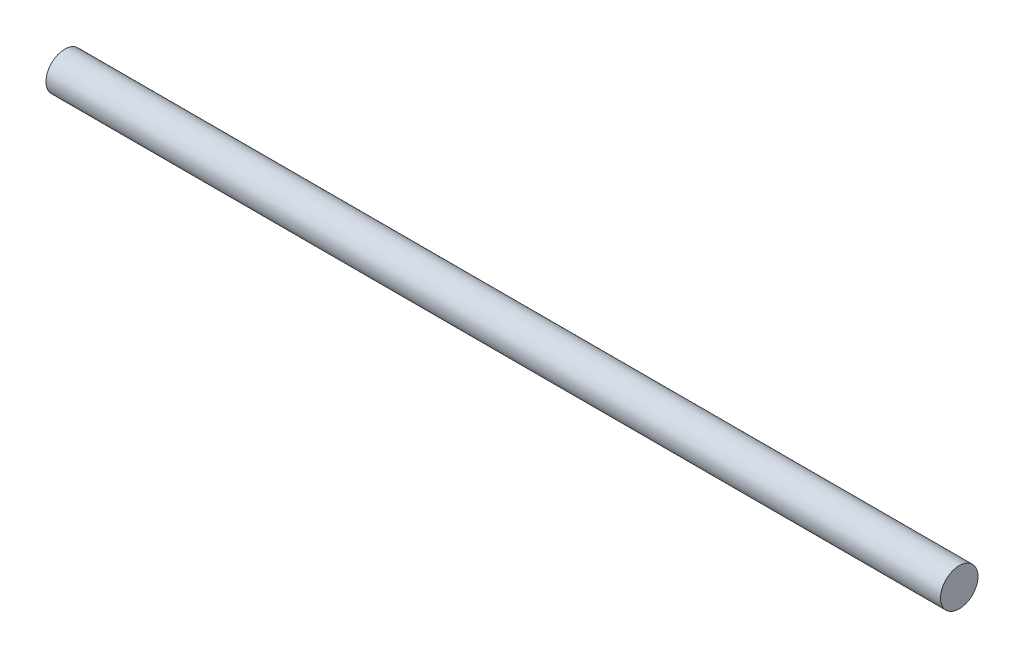
ISO-10303-21;
HEADER;
FILE_DESCRIPTION(('STEP AP214'),'2;1');
FILE_NAME('part.step','',(''),(''),'','','');
FILE_SCHEMA(('AUTOMOTIVE_DESIGN { 1 0 10303 214 1 1 1 1 }'));
ENDSEC;
DATA;
#1=APPLICATION_CONTEXT('core data for automotive mechanical design processes');
#2=APPLICATION_PROTOCOL_DEFINITION('international standard','automotive_design',2000,#1);
#3=PRODUCT_CONTEXT('',#1,'mechanical');
#4=PRODUCT('Part','Part','',(#3));
#5=PRODUCT_RELATED_PRODUCT_CATEGORY('part','',(#4));
#6=PRODUCT_DEFINITION_FORMATION('','',#4);
#7=PRODUCT_DEFINITION_CONTEXT('part definition',#1,'design');
#8=PRODUCT_DEFINITION('design','',#6,#7);
#9=PRODUCT_DEFINITION_SHAPE('','',#8);
#10=(LENGTH_UNIT() NAMED_UNIT(*) SI_UNIT(.MILLI.,.METRE.));
#11=(NAMED_UNIT(*) PLANE_ANGLE_UNIT() SI_UNIT($,.RADIAN.));
#12=(NAMED_UNIT(*) SI_UNIT($,.STERADIAN.) SOLID_ANGLE_UNIT());
#13=UNCERTAINTY_MEASURE_WITH_UNIT(LENGTH_MEASURE(1.E-05),#10,'distance_accuracy_value','');
#14=(GEOMETRIC_REPRESENTATION_CONTEXT(3) GLOBAL_UNCERTAINTY_ASSIGNED_CONTEXT((#13)) GLOBAL_UNIT_ASSIGNED_CONTEXT((#10,
#11,#12)) REPRESENTATION_CONTEXT('',''));
#15=CARTESIAN_POINT('',(0.,0.,0.));
#16=DIRECTION('',(0.,0.,1.));
#17=DIRECTION('',(1.,0.,0.));
#18=AXIS2_PLACEMENT_3D('',#15,#16,#17);
#19=CARTESIAN_POINT('',(310.,0.,0.));
#20=DIRECTION('',(-1.,0.,0.));
#21=DIRECTION('',(0.,0.,1.));
#22=AXIS2_PLACEMENT_3D('',#19,#20,#21);
#23=CYLINDRICAL_SURFACE('',#22,6.5);
#24=CARTESIAN_POINT('',(310.,0.,0.));
#25=DIRECTION('',(1.,0.,0.));
#26=DIRECTION('',(0.,0.,-1.));
#27=AXIS2_PLACEMENT_3D('',#24,#25,#26);
#28=CIRCLE('',#27,6.5);
#29=CARTESIAN_POINT('',(310.,0.,-6.5));
#30=VERTEX_POINT('',#29);
#31=EDGE_CURVE('E10',#30,#30,#28,.T.);
#32=ORIENTED_EDGE('',*,*,#31,.F.);
#33=EDGE_LOOP('',(#32));
#34=FACE_BOUND('',#33,.T.);
#35=CARTESIAN_POINT('',(0.,0.,0.));
#36=DIRECTION('',(1.,0.,0.));
#37=DIRECTION('',(0.,0.,-1.));
#38=AXIS2_PLACEMENT_3D('',#35,#36,#37);
#39=CIRCLE('',#38,6.5);
#40=CARTESIAN_POINT('',(0.,0.,-6.5));
#41=VERTEX_POINT('',#40);
#42=EDGE_CURVE('E42',#41,#41,#39,.T.);
#43=ORIENTED_EDGE('',*,*,#42,.T.);
#44=EDGE_LOOP('',(#43));
#45=FACE_BOUND('',#44,.T.);
#46=ADVANCED_FACE('F39',(#34,#45),#23,.T.);
#47=CARTESIAN_POINT('',(310.,0.,0.));
#48=DIRECTION('',(1.,0.,0.));
#49=DIRECTION('',(0.,0.,-1.));
#50=AXIS2_PLACEMENT_3D('',#47,#48,#49);
#51=PLANE('',#50);
#52=ORIENTED_EDGE('',*,*,#31,.T.);
#53=EDGE_LOOP('',(#52));
#54=FACE_BOUND('',#53,.T.);
#55=ADVANCED_FACE('F54',(#54),#51,.T.);
#56=CARTESIAN_POINT('',(0.,0.,0.));
#57=DIRECTION('',(1.,0.,0.));
#58=DIRECTION('',(0.,0.,-1.));
#59=AXIS2_PLACEMENT_3D('',#56,#57,#58);
#60=PLANE('',#59);
#61=ORIENTED_EDGE('',*,*,#42,.F.);
#62=EDGE_LOOP('',(#61));
#63=FACE_BOUND('',#62,.T.);
#64=ADVANCED_FACE('F52',(#63),#60,.F.);
#65=CLOSED_SHELL('',(#46,#55,#64));
#66=MANIFOLD_SOLID_BREP('B2',#65);
#67=ADVANCED_BREP_SHAPE_REPRESENTATION('',(#18,#66),#14);
#68=SHAPE_DEFINITION_REPRESENTATION(#9,#67);
ENDSEC;
END-ISO-10303-21;
